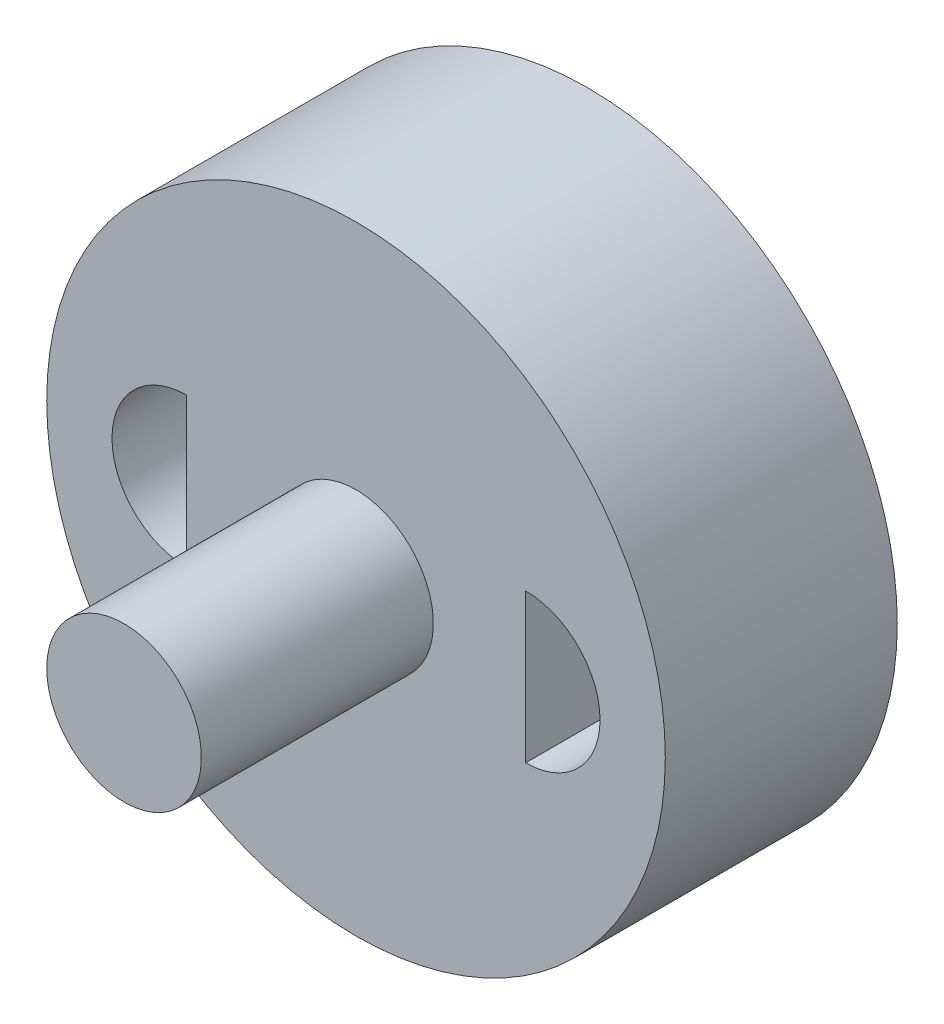
ISO-10303-21;
HEADER;
FILE_DESCRIPTION(('STEP AP214'),'2;1');
FILE_NAME('part.step','',(''),(''),'','','');
FILE_SCHEMA(('AUTOMOTIVE_DESIGN { 1 0 10303 214 1 1 1 1 }'));
ENDSEC;
DATA;
#1=APPLICATION_CONTEXT('core data for automotive mechanical design processes');
#2=APPLICATION_PROTOCOL_DEFINITION('international standard','automotive_design',2000,#1);
#3=PRODUCT_CONTEXT('',#1,'mechanical');
#4=PRODUCT('Part','Part','',(#3));
#5=PRODUCT_RELATED_PRODUCT_CATEGORY('part','',(#4));
#6=PRODUCT_DEFINITION_FORMATION('','',#4);
#7=PRODUCT_DEFINITION_CONTEXT('part definition',#1,'design');
#8=PRODUCT_DEFINITION('design','',#6,#7);
#9=PRODUCT_DEFINITION_SHAPE('','',#8);
#10=(LENGTH_UNIT() NAMED_UNIT(*) SI_UNIT(.MILLI.,.METRE.));
#11=(NAMED_UNIT(*) PLANE_ANGLE_UNIT() SI_UNIT($,.RADIAN.));
#12=(NAMED_UNIT(*) SI_UNIT($,.STERADIAN.) SOLID_ANGLE_UNIT());
#13=UNCERTAINTY_MEASURE_WITH_UNIT(LENGTH_MEASURE(1.E-05),#10,'distance_accuracy_value','');
#14=(GEOMETRIC_REPRESENTATION_CONTEXT(3) GLOBAL_UNCERTAINTY_ASSIGNED_CONTEXT((#13)) GLOBAL_UNIT_ASSIGNED_CONTEXT((#10,
#11,#12)) REPRESENTATION_CONTEXT('',''));
#15=CARTESIAN_POINT('',(0.,0.,0.));
#16=DIRECTION('',(0.,0.,1.));
#17=DIRECTION('',(1.,0.,0.));
#18=AXIS2_PLACEMENT_3D('',#15,#16,#17);
#19=CARTESIAN_POINT('',(0.,0.,76.2));
#20=DIRECTION('',(0.,0.,1.));
#21=DIRECTION('',(1.,0.,0.));
#22=AXIS2_PLACEMENT_3D('',#19,#20,#21);
#23=PLANE('',#22);
#24=CARTESIAN_POINT('',(0.,0.,76.2));
#25=DIRECTION('',(0.,0.,1.));
#26=DIRECTION('',(1.,0.,0.));
#27=AXIS2_PLACEMENT_3D('',#24,#25,#26);
#28=CIRCLE('',#27,25.4);
#29=CARTESIAN_POINT('',(-25.4,0.,76.2));
#30=VERTEX_POINT('',#29);
#31=EDGE_CURVE('E11',#30,#30,#28,.T.);
#32=ORIENTED_EDGE('',*,*,#31,.F.);
#33=EDGE_LOOP('',(#32));
#34=FACE_BOUND('',#33,.T.);
#35=DIRECTION('',(0.,1.,0.));
#36=VECTOR('',#35,1.);
#37=CARTESIAN_POINT('',(55.7030268418047,0.,76.2));
#38=LINE('',#37,#36);
#39=CARTESIAN_POINT('',(55.7030268418047,24.4621758088346,76.2));
#40=VERTEX_POINT('',#39);
#41=CARTESIAN_POINT('',(55.7030268418047,-24.4621758088346,76.2));
#42=VERTEX_POINT('',#41);
#43=EDGE_CURVE('E113',#40,#42,#38,.F.);
#44=ORIENTED_EDGE('',*,*,#43,.F.);
#45=CARTESIAN_POINT('',(55.7030268418047,0.,76.2));
#46=DIRECTION('',(0.,0.,1.));
#47=DIRECTION('',(1.,0.,0.));
#48=AXIS2_PLACEMENT_3D('',#45,#46,#47);
#49=CIRCLE('',#48,24.4621758088346);
#50=EDGE_CURVE('E97',#42,#40,#49,.T.);
#51=ORIENTED_EDGE('',*,*,#50,.F.);
#52=EDGE_LOOP('',(#44,#51));
#53=FACE_BOUND('',#52,.T.);
#54=CARTESIAN_POINT('',(0.,0.,76.2));
#55=DIRECTION('',(0.,0.,1.));
#56=DIRECTION('',(1.,0.,0.));
#57=AXIS2_PLACEMENT_3D('',#54,#55,#56);
#58=CIRCLE('',#57,101.6);
#59=CARTESIAN_POINT('',(-101.6,0.,76.2));
#60=VERTEX_POINT('',#59);
#61=EDGE_CURVE('E48',#60,#60,#58,.T.);
#62=ORIENTED_EDGE('',*,*,#61,.T.);
#63=EDGE_LOOP('',(#62));
#64=FACE_BOUND('',#63,.T.);
#65=DIRECTION('',(0.,1.,0.));
#66=VECTOR('',#65,1.);
#67=CARTESIAN_POINT('',(-55.7030268418047,0.,76.2));
#68=LINE('',#67,#66);
#69=CARTESIAN_POINT('',(-55.7030268418047,24.4621758088346,76.2));
#70=VERTEX_POINT('',#69);
#71=CARTESIAN_POINT('',(-55.7030268418047,-24.4621758088346,76.2));
#72=VERTEX_POINT('',#71);
#73=EDGE_CURVE('E115',#70,#72,#68,.F.);
#74=ORIENTED_EDGE('',*,*,#73,.T.);
#75=CARTESIAN_POINT('',(-55.7030268418047,0.,76.2));
#76=DIRECTION('',(0.,0.,1.));
#77=DIRECTION('',(1.,0.,0.));
#78=AXIS2_PLACEMENT_3D('',#75,#76,#77);
#79=CIRCLE('',#78,24.4621758088346);
#80=EDGE_CURVE('E42',#72,#70,#79,.F.);
#81=ORIENTED_EDGE('',*,*,#80,.T.);
#82=EDGE_LOOP('',(#74,#81));
#83=FACE_BOUND('',#82,.T.);
#84=ADVANCED_FACE('F38',(#34,#53,#64,#83),#23,.T.);
#85=CARTESIAN_POINT('',(0.,0.,0.));
#86=DIRECTION('',(0.,0.,1.));
#87=DIRECTION('',(1.,0.,0.));
#88=AXIS2_PLACEMENT_3D('',#85,#86,#87);
#89=PLANE('',#88);
#90=CARTESIAN_POINT('',(0.,0.,0.));
#91=DIRECTION('',(0.,0.,1.));
#92=DIRECTION('',(1.,0.,0.));
#93=AXIS2_PLACEMENT_3D('',#90,#91,#92);
#94=CIRCLE('',#93,101.6);
#95=CARTESIAN_POINT('',(-101.6,0.,0.));
#96=VERTEX_POINT('',#95);
#97=EDGE_CURVE('E109',#96,#96,#94,.T.);
#98=ORIENTED_EDGE('',*,*,#97,.F.);
#99=EDGE_LOOP('',(#98));
#100=FACE_BOUND('',#99,.T.);
#101=CARTESIAN_POINT('',(55.7030268418047,0.,0.));
#102=DIRECTION('',(0.,0.,1.));
#103=DIRECTION('',(1.,0.,0.));
#104=AXIS2_PLACEMENT_3D('',#101,#102,#103);
#105=CIRCLE('',#104,24.4621758088346);
#106=CARTESIAN_POINT('',(55.7030268418047,-24.4621758088346,0.));
#107=VERTEX_POINT('',#106);
#108=CARTESIAN_POINT('',(55.7030268418047,24.4621758088346,0.));
#109=VERTEX_POINT('',#108);
#110=EDGE_CURVE('E102',#107,#109,#105,.T.);
#111=ORIENTED_EDGE('',*,*,#110,.T.);
#112=DIRECTION('',(0.,-1.,0.));
#113=VECTOR('',#112,1.);
#114=CARTESIAN_POINT('',(55.7030268418047,0.,0.));
#115=LINE('',#114,#113);
#116=EDGE_CURVE('E99',#109,#107,#115,.T.);
#117=ORIENTED_EDGE('',*,*,#116,.T.);
#118=EDGE_LOOP('',(#111,#117));
#119=FACE_BOUND('',#118,.T.);
#120=CARTESIAN_POINT('',(-55.7030268418047,0.,0.));
#121=DIRECTION('',(0.,0.,1.));
#122=DIRECTION('',(1.,0.,0.));
#123=AXIS2_PLACEMENT_3D('',#120,#121,#122);
#124=CIRCLE('',#123,24.4621758088346);
#125=CARTESIAN_POINT('',(-55.7030268418047,-24.4621758088346,0.));
#126=VERTEX_POINT('',#125);
#127=CARTESIAN_POINT('',(-55.7030268418047,24.4621758088346,0.));
#128=VERTEX_POINT('',#127);
#129=EDGE_CURVE('E82',#126,#128,#124,.F.);
#130=ORIENTED_EDGE('',*,*,#129,.F.);
#131=DIRECTION('',(0.,-1.,0.));
#132=VECTOR('',#131,1.);
#133=CARTESIAN_POINT('',(-55.7030268418047,0.,0.));
#134=LINE('',#133,#132);
#135=EDGE_CURVE('E75',#128,#126,#134,.T.);
#136=ORIENTED_EDGE('',*,*,#135,.F.);
#137=EDGE_LOOP('',(#130,#136));
#138=FACE_BOUND('',#137,.T.);
#139=ADVANCED_FACE('F89',(#100,#119,#138),#89,.F.);
#140=CARTESIAN_POINT('',(0.,0.,76.2));
#141=DIRECTION('',(0.,0.,-1.));
#142=DIRECTION('',(-1.,0.,0.));
#143=AXIS2_PLACEMENT_3D('',#140,#141,#142);
#144=CYLINDRICAL_SURFACE('',#143,101.6);
#145=CARTESIAN_POINT('',(-101.6,0.,76.2));
#146=CARTESIAN_POINT('',(-101.6,0.,75.40625));
#147=CARTESIAN_POINT('',(-101.6,0.,74.6125));
#148=CARTESIAN_POINT('',(-101.6,0.,73.025));
#149=CARTESIAN_POINT('',(-101.6,0.,72.23125));
#150=CARTESIAN_POINT('',(-101.6,0.,70.64375));
#151=CARTESIAN_POINT('',(-101.6,0.,69.85));
#152=CARTESIAN_POINT('',(-101.6,0.,68.2625));
#153=CARTESIAN_POINT('',(-101.6,0.,67.46875));
#154=CARTESIAN_POINT('',(-101.6,0.,65.88125));
#155=CARTESIAN_POINT('',(-101.6,0.,65.0875));
#156=CARTESIAN_POINT('',(-101.6,0.,63.5));
#157=CARTESIAN_POINT('',(-101.6,0.,62.70625));
#158=CARTESIAN_POINT('',(-101.6,0.,61.11875));
#159=CARTESIAN_POINT('',(-101.6,0.,60.325));
#160=CARTESIAN_POINT('',(-101.6,0.,58.7375));
#161=CARTESIAN_POINT('',(-101.6,0.,57.94375));
#162=CARTESIAN_POINT('',(-101.6,0.,56.35625));
#163=CARTESIAN_POINT('',(-101.6,0.,55.5625));
#164=CARTESIAN_POINT('',(-101.6,0.,53.975));
#165=CARTESIAN_POINT('',(-101.6,0.,53.18125));
#166=CARTESIAN_POINT('',(-101.6,0.,51.59375));
#167=CARTESIAN_POINT('',(-101.6,0.,50.8));
#168=CARTESIAN_POINT('',(-101.6,0.,49.2125));
#169=CARTESIAN_POINT('',(-101.6,0.,48.41875));
#170=CARTESIAN_POINT('',(-101.6,0.,46.83125));
#171=CARTESIAN_POINT('',(-101.6,0.,46.0375));
#172=CARTESIAN_POINT('',(-101.6,0.,44.45));
#173=CARTESIAN_POINT('',(-101.6,0.,43.65625));
#174=CARTESIAN_POINT('',(-101.6,0.,42.06875));
#175=CARTESIAN_POINT('',(-101.6,0.,41.275));
#176=CARTESIAN_POINT('',(-101.6,0.,39.6875));
#177=CARTESIAN_POINT('',(-101.6,0.,38.89375));
#178=CARTESIAN_POINT('',(-101.6,0.,37.30625));
#179=CARTESIAN_POINT('',(-101.6,0.,36.5125));
#180=CARTESIAN_POINT('',(-101.6,0.,34.925));
#181=CARTESIAN_POINT('',(-101.6,0.,34.13125));
#182=CARTESIAN_POINT('',(-101.6,0.,32.54375));
#183=CARTESIAN_POINT('',(-101.6,0.,31.75));
#184=CARTESIAN_POINT('',(-101.6,0.,30.1625));
#185=CARTESIAN_POINT('',(-101.6,0.,29.36875));
#186=CARTESIAN_POINT('',(-101.6,0.,27.78125));
#187=CARTESIAN_POINT('',(-101.6,0.,26.9875));
#188=CARTESIAN_POINT('',(-101.6,0.,25.4));
#189=CARTESIAN_POINT('',(-101.6,0.,24.60625));
#190=CARTESIAN_POINT('',(-101.6,0.,23.01875));
#191=CARTESIAN_POINT('',(-101.6,0.,22.225));
#192=CARTESIAN_POINT('',(-101.6,0.,20.6375));
#193=CARTESIAN_POINT('',(-101.6,0.,19.84375));
#194=CARTESIAN_POINT('',(-101.6,0.,18.25625));
#195=CARTESIAN_POINT('',(-101.6,0.,17.4625));
#196=CARTESIAN_POINT('',(-101.6,0.,15.875));
#197=CARTESIAN_POINT('',(-101.6,0.,15.08125));
#198=CARTESIAN_POINT('',(-101.6,0.,13.49375));
#199=CARTESIAN_POINT('',(-101.6,0.,12.7));
#200=CARTESIAN_POINT('',(-101.6,0.,11.1125));
#201=CARTESIAN_POINT('',(-101.6,0.,10.31875));
#202=CARTESIAN_POINT('',(-101.6,0.,8.73125));
#203=CARTESIAN_POINT('',(-101.6,0.,7.93750000000001));
#204=CARTESIAN_POINT('',(-101.6,0.,6.35));
#205=CARTESIAN_POINT('',(-101.6,0.,5.55625));
#206=CARTESIAN_POINT('',(-101.6,0.,3.96875));
#207=CARTESIAN_POINT('',(-101.6,0.,3.175));
#208=CARTESIAN_POINT('',(-101.6,0.,1.5875));
#209=CARTESIAN_POINT('',(-101.6,0.,0.793750000000001));
#210=CARTESIAN_POINT('',(-101.6,0.,0.));
#211=B_SPLINE_CURVE_WITH_KNOTS('',3,(#145,#146,#147,#148,#149,#150,#151,#152,#153,#154,#155,
#156,#157,#158,#159,#160,#161,#162,#163,#164,#165,#166,#167,#168,#169,#170,#171,#172,#173,#174,
#175,#176,#177,#178,#179,#180,#181,#182,#183,#184,#185,#186,#187,#188,#189,#190,#191,#192,#193,
#194,#195,#196,#197,#198,#199,#200,#201,#202,#203,#204,#205,#206,#207,#208,#209,#210),
.UNSPECIFIED.,.F.,.F.,(4,2,2,2,2,2,2,2,2,2,2,2,2,2,2,2,2,2,2,2,2,2,2,2,2,2,2,2,2,2,2,2,4),(0.,
2.38125,4.7625,7.14375,9.52500000000001,11.90625,14.2875,16.66875,19.05,21.43125,23.8125,
26.19375,28.575,30.95625,33.3375,35.71875,38.1,40.48125,42.8625,45.24375,47.625,50.00625,
52.3875,54.76875,57.15,59.53125,61.9125,64.29375,66.675,69.05625,71.4375,73.81875,76.2),.UNSPECIFIED.);
#212=EDGE_CURVE('BSEAM40',#60,#96,#211,.T.);
#213=ORIENTED_EDGE('',*,*,#61,.F.);
#214=ORIENTED_EDGE('',*,*,#97,.T.);
#215=ORIENTED_EDGE('',*,*,#212,.T.);
#216=ORIENTED_EDGE('',*,*,#212,.F.);
#217=EDGE_LOOP('',(#213,#215,#214,#216));
#218=FACE_BOUND('',#217,.T.);
#219=ADVANCED_FACE('F40',(#218),#144,.T.);
#220=CARTESIAN_POINT('',(55.7030268418047,0.,0.));
#221=DIRECTION('',(-1.,0.,0.));
#222=DIRECTION('',(0.,0.,1.));
#223=AXIS2_PLACEMENT_3D('',#220,#221,#222);
#224=PLANE('',#223);
#225=ORIENTED_EDGE('',*,*,#43,.T.);
#226=DIRECTION('',(0.,0.,1.));
#227=VECTOR('',#226,1.);
#228=CARTESIAN_POINT('',(55.7030268418047,-24.4621758088346,0.));
#229=LINE('',#228,#227);
#230=EDGE_CURVE('E93',#107,#42,#229,.T.);
#231=ORIENTED_EDGE('',*,*,#230,.F.);
#232=ORIENTED_EDGE('',*,*,#116,.F.);
#233=DIRECTION('',(0.,0.,1.));
#234=VECTOR('',#233,1.);
#235=CARTESIAN_POINT('',(55.7030268418047,24.4621758088346,0.));
#236=LINE('',#235,#234);
#237=EDGE_CURVE('E90',#109,#40,#236,.T.);
#238=ORIENTED_EDGE('',*,*,#237,.T.);
#239=EDGE_LOOP('',(#225,#231,#232,#238));
#240=FACE_BOUND('',#239,.T.);
#241=ADVANCED_FACE('F127',(#240),#224,.F.);
#242=CARTESIAN_POINT('',(55.7030268418047,0.,0.));
#243=DIRECTION('',(0.,0.,1.));
#244=DIRECTION('',(1.,0.,0.));
#245=AXIS2_PLACEMENT_3D('',#242,#243,#244);
#246=CYLINDRICAL_SURFACE('',#245,24.4621758088346);
#247=ORIENTED_EDGE('',*,*,#50,.T.);
#248=ORIENTED_EDGE('',*,*,#237,.F.);
#249=ORIENTED_EDGE('',*,*,#110,.F.);
#250=ORIENTED_EDGE('',*,*,#230,.T.);
#251=EDGE_LOOP('',(#247,#248,#249,#250));
#252=FACE_BOUND('',#251,.T.);
#253=ADVANCED_FACE('F130',(#252),#246,.F.);
#254=CARTESIAN_POINT('',(-55.7030268418047,0.,0.));
#255=DIRECTION('',(0.,0.,1.));
#256=DIRECTION('',(1.,0.,0.));
#257=AXIS2_PLACEMENT_3D('',#254,#255,#256);
#258=CYLINDRICAL_SURFACE('',#257,24.4621758088346);
#259=DIRECTION('',(0.,0.,1.));
#260=VECTOR('',#259,1.);
#261=CARTESIAN_POINT('',(-55.7030268418047,-24.4621758088346,0.));
#262=LINE('',#261,#260);
#263=EDGE_CURVE('E56',#126,#72,#262,.T.);
#264=ORIENTED_EDGE('',*,*,#263,.F.);
#265=ORIENTED_EDGE('',*,*,#129,.T.);
#266=DIRECTION('',(0.,0.,1.));
#267=VECTOR('',#266,1.);
#268=CARTESIAN_POINT('',(-55.7030268418047,24.4621758088346,0.));
#269=LINE('',#268,#267);
#270=EDGE_CURVE('E78',#128,#70,#269,.T.);
#271=ORIENTED_EDGE('',*,*,#270,.T.);
#272=ORIENTED_EDGE('',*,*,#80,.F.);
#273=EDGE_LOOP('',(#264,#265,#271,#272));
#274=FACE_BOUND('',#273,.T.);
#275=ADVANCED_FACE('F85',(#274),#258,.F.);
#276=CARTESIAN_POINT('',(-55.7030268418047,0.,0.));
#277=DIRECTION('',(-1.,0.,0.));
#278=DIRECTION('',(0.,0.,1.));
#279=AXIS2_PLACEMENT_3D('',#276,#277,#278);
#280=PLANE('',#279);
#281=ORIENTED_EDGE('',*,*,#270,.F.);
#282=ORIENTED_EDGE('',*,*,#135,.T.);
#283=ORIENTED_EDGE('',*,*,#263,.T.);
#284=ORIENTED_EDGE('',*,*,#73,.F.);
#285=EDGE_LOOP('',(#281,#282,#283,#284));
#286=FACE_BOUND('',#285,.T.);
#287=ADVANCED_FACE('F76',(#286),#280,.T.);
#288=CARTESIAN_POINT('',(0.,0.,152.4));
#289=DIRECTION('',(0.,0.,-1.));
#290=DIRECTION('',(-1.,0.,0.));
#291=AXIS2_PLACEMENT_3D('',#288,#289,#290);
#292=CYLINDRICAL_SURFACE('',#291,25.4);
#293=CARTESIAN_POINT('',(0.,0.,152.4));
#294=DIRECTION('',(0.,0.,1.));
#295=DIRECTION('',(1.,0.,0.));
#296=AXIS2_PLACEMENT_3D('',#293,#294,#295);
#297=CIRCLE('',#296,25.4);
#298=CARTESIAN_POINT('',(-25.4,0.,152.4));
#299=VERTEX_POINT('',#298);
#300=EDGE_CURVE('E103',#299,#299,#297,.T.);
#301=CARTESIAN_POINT('',(-25.4,0.,152.4));
#302=CARTESIAN_POINT('',(-25.4,0.,151.60625));
#303=CARTESIAN_POINT('',(-25.4,0.,150.8125));
#304=CARTESIAN_POINT('',(-25.4,0.,149.225));
#305=CARTESIAN_POINT('',(-25.4,0.,148.43125));
#306=CARTESIAN_POINT('',(-25.4,0.,146.84375));
#307=CARTESIAN_POINT('',(-25.4,0.,146.05));
#308=CARTESIAN_POINT('',(-25.4,0.,144.4625));
#309=CARTESIAN_POINT('',(-25.4,0.,143.66875));
#310=CARTESIAN_POINT('',(-25.4,0.,142.08125));
#311=CARTESIAN_POINT('',(-25.4,0.,141.2875));
#312=CARTESIAN_POINT('',(-25.4,0.,139.7));
#313=CARTESIAN_POINT('',(-25.4,0.,138.90625));
#314=CARTESIAN_POINT('',(-25.4,0.,137.31875));
#315=CARTESIAN_POINT('',(-25.4,0.,136.525));
#316=CARTESIAN_POINT('',(-25.4,0.,134.9375));
#317=CARTESIAN_POINT('',(-25.4,0.,134.14375));
#318=CARTESIAN_POINT('',(-25.4,0.,132.55625));
#319=CARTESIAN_POINT('',(-25.4,0.,131.7625));
#320=CARTESIAN_POINT('',(-25.4,0.,130.175));
#321=CARTESIAN_POINT('',(-25.4,0.,129.38125));
#322=CARTESIAN_POINT('',(-25.4,0.,127.79375));
#323=CARTESIAN_POINT('',(-25.4,0.,127.));
#324=CARTESIAN_POINT('',(-25.4,0.,125.4125));
#325=CARTESIAN_POINT('',(-25.4,0.,124.61875));
#326=CARTESIAN_POINT('',(-25.4,0.,123.03125));
#327=CARTESIAN_POINT('',(-25.4,0.,122.2375));
#328=CARTESIAN_POINT('',(-25.4,0.,120.65));
#329=CARTESIAN_POINT('',(-25.4,0.,119.85625));
#330=CARTESIAN_POINT('',(-25.4,0.,118.26875));
#331=CARTESIAN_POINT('',(-25.4,0.,117.475));
#332=CARTESIAN_POINT('',(-25.4,0.,115.8875));
#333=CARTESIAN_POINT('',(-25.4,0.,115.09375));
#334=CARTESIAN_POINT('',(-25.4,0.,113.50625));
#335=CARTESIAN_POINT('',(-25.4,0.,112.7125));
#336=CARTESIAN_POINT('',(-25.4,0.,111.125));
#337=CARTESIAN_POINT('',(-25.4,0.,110.33125));
#338=CARTESIAN_POINT('',(-25.4,0.,108.74375));
#339=CARTESIAN_POINT('',(-25.4,0.,107.95));
#340=CARTESIAN_POINT('',(-25.4,0.,106.3625));
#341=CARTESIAN_POINT('',(-25.4,0.,105.56875));
#342=CARTESIAN_POINT('',(-25.4,0.,103.98125));
#343=CARTESIAN_POINT('',(-25.4,0.,103.1875));
#344=CARTESIAN_POINT('',(-25.4,0.,101.6));
#345=CARTESIAN_POINT('',(-25.4,0.,100.80625));
#346=CARTESIAN_POINT('',(-25.4,0.,99.21875));
#347=CARTESIAN_POINT('',(-25.4,0.,98.425));
#348=CARTESIAN_POINT('',(-25.4,0.,96.8375));
#349=CARTESIAN_POINT('',(-25.4,0.,96.04375));
#350=CARTESIAN_POINT('',(-25.4,0.,94.45625));
#351=CARTESIAN_POINT('',(-25.4,0.,93.6625));
#352=CARTESIAN_POINT('',(-25.4,0.,92.075));
#353=CARTESIAN_POINT('',(-25.4,0.,91.28125));
#354=CARTESIAN_POINT('',(-25.4,0.,89.69375));
#355=CARTESIAN_POINT('',(-25.4,0.,88.9));
#356=CARTESIAN_POINT('',(-25.4,0.,87.3125));
#357=CARTESIAN_POINT('',(-25.4,0.,86.51875));
#358=CARTESIAN_POINT('',(-25.4,0.,84.93125));
#359=CARTESIAN_POINT('',(-25.4,0.,84.1375));
#360=CARTESIAN_POINT('',(-25.4,0.,82.55));
#361=CARTESIAN_POINT('',(-25.4,0.,81.75625));
#362=CARTESIAN_POINT('',(-25.4,0.,80.16875));
#363=CARTESIAN_POINT('',(-25.4,0.,79.375));
#364=CARTESIAN_POINT('',(-25.4,0.,77.7875));
#365=CARTESIAN_POINT('',(-25.4,0.,76.99375));
#366=CARTESIAN_POINT('',(-25.4,0.,76.2));
#367=B_SPLINE_CURVE_WITH_KNOTS('',3,(#301,#302,#303,#304,#305,#306,#307,#308,#309,#310,#311,
#312,#313,#314,#315,#316,#317,#318,#319,#320,#321,#322,#323,#324,#325,#326,#327,#328,#329,#330,
#331,#332,#333,#334,#335,#336,#337,#338,#339,#340,#341,#342,#343,#344,#345,#346,#347,#348,#349,
#350,#351,#352,#353,#354,#355,#356,#357,#358,#359,#360,#361,#362,#363,#364,#365,#366),
.UNSPECIFIED.,.F.,.F.,(4,2,2,2,2,2,2,2,2,2,2,2,2,2,2,2,2,2,2,2,2,2,2,2,2,2,2,2,2,2,2,2,4),(0.,
2.38125,4.7625,7.14375,9.52500000000001,11.90625,14.2875,16.66875,19.05,21.43125,23.8125,
26.19375,28.575,30.95625,33.3375,35.71875,38.1,40.48125,42.8625,45.24375,47.625,50.00625,
52.3875,54.76875,57.15,59.53125,61.9125,64.29375,66.675,69.05625,71.4375,73.81875,76.2),.UNSPECIFIED.);
#368=EDGE_CURVE('BSEAM139',#299,#30,#367,.T.);
#369=ORIENTED_EDGE('',*,*,#300,.F.);
#370=ORIENTED_EDGE('',*,*,#31,.T.);
#371=ORIENTED_EDGE('',*,*,#368,.T.);
#372=ORIENTED_EDGE('',*,*,#368,.F.);
#373=EDGE_LOOP('',(#369,#371,#370,#372));
#374=FACE_BOUND('',#373,.T.);
#375=ADVANCED_FACE('F139',(#374),#292,.T.);
#376=CARTESIAN_POINT('',(0.,0.,152.4));
#377=DIRECTION('',(0.,0.,1.));
#378=DIRECTION('',(1.,0.,0.));
#379=AXIS2_PLACEMENT_3D('',#376,#377,#378);
#380=PLANE('',#379);
#381=ORIENTED_EDGE('',*,*,#300,.T.);
#382=EDGE_LOOP('',(#381));
#383=FACE_BOUND('',#382,.T.);
#384=ADVANCED_FACE('F142',(#383),#380,.T.);
#385=CLOSED_SHELL('',(#84,#139,#219,#241,#253,#275,#287,#375,#384));
#386=MANIFOLD_SOLID_BREP('B2',#385);
#387=ADVANCED_BREP_SHAPE_REPRESENTATION('',(#18,#386),#14);
#388=SHAPE_DEFINITION_REPRESENTATION(#9,#387);
ENDSEC;
END-ISO-10303-21;
